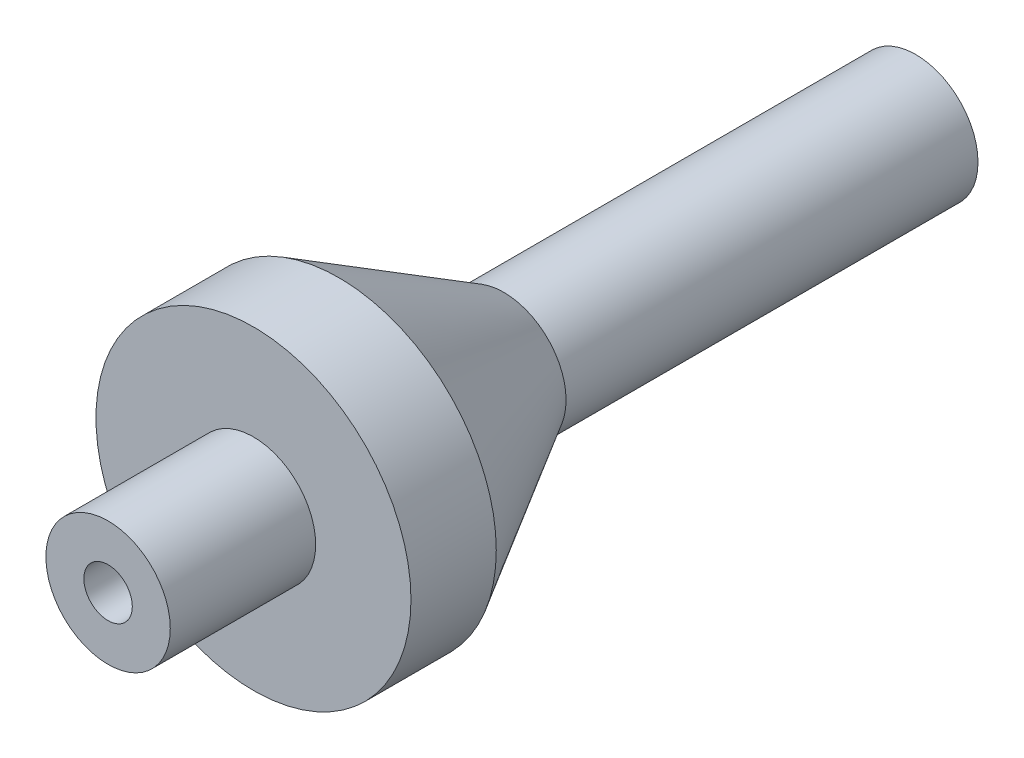
ISO-10303-21;
HEADER;
FILE_DESCRIPTION(('STEP AP214'),'2;1');
FILE_NAME('part.step','',(''),(''),'','','');
FILE_SCHEMA(('AUTOMOTIVE_DESIGN { 1 0 10303 214 1 1 1 1 }'));
ENDSEC;
DATA;
#1=APPLICATION_CONTEXT('core data for automotive mechanical design processes');
#2=APPLICATION_PROTOCOL_DEFINITION('international standard','automotive_design',2000,#1);
#3=PRODUCT_CONTEXT('',#1,'mechanical');
#4=PRODUCT('Part','Part','',(#3));
#5=PRODUCT_RELATED_PRODUCT_CATEGORY('part','',(#4));
#6=PRODUCT_DEFINITION_FORMATION('','',#4);
#7=PRODUCT_DEFINITION_CONTEXT('part definition',#1,'design');
#8=PRODUCT_DEFINITION('design','',#6,#7);
#9=PRODUCT_DEFINITION_SHAPE('','',#8);
#10=(LENGTH_UNIT() NAMED_UNIT(*) SI_UNIT(.MILLI.,.METRE.));
#11=(NAMED_UNIT(*) PLANE_ANGLE_UNIT() SI_UNIT($,.RADIAN.));
#12=(NAMED_UNIT(*) SI_UNIT($,.STERADIAN.) SOLID_ANGLE_UNIT());
#13=UNCERTAINTY_MEASURE_WITH_UNIT(LENGTH_MEASURE(1.E-05),#10,'distance_accuracy_value','');
#14=(GEOMETRIC_REPRESENTATION_CONTEXT(3) GLOBAL_UNCERTAINTY_ASSIGNED_CONTEXT((#13)) GLOBAL_UNIT_ASSIGNED_CONTEXT((#10,
#11,#12)) REPRESENTATION_CONTEXT('',''));
#15=CARTESIAN_POINT('',(0.,0.,0.));
#16=DIRECTION('',(0.,0.,1.));
#17=DIRECTION('',(1.,0.,0.));
#18=AXIS2_PLACEMENT_3D('',#15,#16,#17);
#19=CARTESIAN_POINT('',(0.,0.,0.));
#20=DIRECTION('',(0.,0.,1.));
#21=DIRECTION('',(1.,0.,0.));
#22=AXIS2_PLACEMENT_3D('',#19,#20,#21);
#23=CYLINDRICAL_SURFACE('',#22,1.5);
#24=CARTESIAN_POINT('',(0.,0.,0.));
#25=DIRECTION('',(0.,0.,1.));
#26=DIRECTION('',(1.,0.,0.));
#27=AXIS2_PLACEMENT_3D('',#24,#25,#26);
#28=CIRCLE('',#27,1.5);
#29=CARTESIAN_POINT('',(1.5,0.,0.));
#30=VERTEX_POINT('',#29);
#31=EDGE_CURVE('E76',#30,#30,#28,.T.);
#32=ORIENTED_EDGE('',*,*,#31,.T.);
#33=EDGE_LOOP('',(#32));
#34=FACE_BOUND('',#33,.T.);
#35=CARTESIAN_POINT('',(0.,0.,-50.));
#36=DIRECTION('',(0.,0.,1.));
#37=DIRECTION('',(1.,0.,0.));
#38=AXIS2_PLACEMENT_3D('',#35,#36,#37);
#39=CIRCLE('',#38,1.5);
#40=CARTESIAN_POINT('',(1.5,0.,-50.));
#41=VERTEX_POINT('',#40);
#42=EDGE_CURVE('E53',#41,#41,#39,.T.);
#43=ORIENTED_EDGE('',*,*,#42,.F.);
#44=EDGE_LOOP('',(#43));
#45=FACE_BOUND('',#44,.T.);
#46=ADVANCED_FACE('F39',(#34,#45),#23,.F.);
#47=CARTESIAN_POINT('',(1.5,0.,-50.));
#48=DIRECTION('',(0.,0.,-1.));
#49=DIRECTION('',(-1.,0.,0.));
#50=AXIS2_PLACEMENT_3D('',#47,#48,#49);
#51=PLANE('',#50);
#52=ORIENTED_EDGE('',*,*,#42,.T.);
#53=EDGE_LOOP('',(#52));
#54=FACE_BOUND('',#53,.T.);
#55=CARTESIAN_POINT('',(0.,0.,-50.));
#56=DIRECTION('',(0.,0.,1.));
#57=DIRECTION('',(1.,0.,0.));
#58=AXIS2_PLACEMENT_3D('',#55,#56,#57);
#59=CIRCLE('',#58,3.84999999999999);
#60=CARTESIAN_POINT('',(3.84999999999999,0.,-50.));
#61=VERTEX_POINT('',#60);
#62=EDGE_CURVE('E58',#61,#61,#59,.T.);
#63=ORIENTED_EDGE('',*,*,#62,.F.);
#64=EDGE_LOOP('',(#63));
#65=FACE_BOUND('',#64,.T.);
#66=ADVANCED_FACE('F97',(#54,#65),#51,.T.);
#67=CARTESIAN_POINT('',(0.,0.,0.));
#68=DIRECTION('',(0.,0.,1.));
#69=DIRECTION('',(1.,0.,0.));
#70=AXIS2_PLACEMENT_3D('',#67,#68,#69);
#71=CYLINDRICAL_SURFACE('',#70,3.85);
#72=CARTESIAN_POINT('',(0.,0.,-24.5));
#73=DIRECTION('',(0.,0.,-1.));
#74=DIRECTION('',(-1.,0.,0.));
#75=AXIS2_PLACEMENT_3D('',#72,#73,#74);
#76=CIRCLE('',#75,3.85);
#77=CARTESIAN_POINT('',(-3.85,0.,-24.5));
#78=VERTEX_POINT('',#77);
#79=EDGE_CURVE('E48',#78,#78,#76,.T.);
#80=ORIENTED_EDGE('',*,*,#79,.T.);
#81=EDGE_LOOP('',(#80));
#82=FACE_BOUND('',#81,.T.);
#83=ORIENTED_EDGE('',*,*,#62,.T.);
#84=EDGE_LOOP('',(#83));
#85=FACE_BOUND('',#84,.T.);
#86=ADVANCED_FACE('F101',(#82,#85),#71,.T.);
#87=CARTESIAN_POINT('',(0.,0.,0.));
#88=DIRECTION('',(0.,0.,1.));
#89=DIRECTION('',(1.,0.,0.));
#90=AXIS2_PLACEMENT_3D('',#87,#88,#89);
#91=CYLINDRICAL_SURFACE('',#90,9.75);
#92=CARTESIAN_POINT('',(0.,0.,-14.2809002353438));
#93=DIRECTION('',(0.,0.,1.));
#94=DIRECTION('',(1.,0.,0.));
#95=AXIS2_PLACEMENT_3D('',#92,#93,#94);
#96=CIRCLE('',#95,9.75);
#97=CARTESIAN_POINT('',(9.75,0.,-14.2809002353438));
#98=VERTEX_POINT('',#97);
#99=EDGE_CURVE('E10',#98,#98,#96,.T.);
#100=ORIENTED_EDGE('',*,*,#99,.T.);
#101=EDGE_LOOP('',(#100));
#102=FACE_BOUND('',#101,.T.);
#103=CARTESIAN_POINT('',(0.,0.,-9.));
#104=DIRECTION('',(0.,0.,1.));
#105=DIRECTION('',(1.,0.,0.));
#106=AXIS2_PLACEMENT_3D('',#103,#104,#105);
#107=CIRCLE('',#106,9.75);
#108=CARTESIAN_POINT('',(9.75,0.,-9.));
#109=VERTEX_POINT('',#108);
#110=EDGE_CURVE('E64',#109,#109,#107,.T.);
#111=ORIENTED_EDGE('',*,*,#110,.F.);
#112=EDGE_LOOP('',(#111));
#113=FACE_BOUND('',#112,.T.);
#114=ADVANCED_FACE('F107',(#102,#113),#91,.T.);
#115=CARTESIAN_POINT('',(9.75,0.,-9.));
#116=DIRECTION('',(0.,0.,1.));
#117=DIRECTION('',(1.,0.,0.));
#118=AXIS2_PLACEMENT_3D('',#115,#116,#117);
#119=PLANE('',#118);
#120=ORIENTED_EDGE('',*,*,#110,.T.);
#121=EDGE_LOOP('',(#120));
#122=FACE_BOUND('',#121,.T.);
#123=CARTESIAN_POINT('',(0.,0.,-9.));
#124=DIRECTION('',(0.,0.,1.));
#125=DIRECTION('',(1.,0.,0.));
#126=AXIS2_PLACEMENT_3D('',#123,#124,#125);
#127=CIRCLE('',#126,3.85);
#128=CARTESIAN_POINT('',(3.85,0.,-9.));
#129=VERTEX_POINT('',#128);
#130=EDGE_CURVE('E68',#129,#129,#127,.T.);
#131=ORIENTED_EDGE('',*,*,#130,.F.);
#132=EDGE_LOOP('',(#131));
#133=FACE_BOUND('',#132,.T.);
#134=ADVANCED_FACE('F93',(#122,#133),#119,.T.);
#135=CARTESIAN_POINT('',(0.,0.,0.));
#136=DIRECTION('',(0.,0.,1.));
#137=DIRECTION('',(1.,0.,0.));
#138=AXIS2_PLACEMENT_3D('',#135,#136,#137);
#139=CYLINDRICAL_SURFACE('',#138,3.85);
#140=ORIENTED_EDGE('',*,*,#130,.T.);
#141=EDGE_LOOP('',(#140));
#142=FACE_BOUND('',#141,.T.);
#143=CARTESIAN_POINT('',(0.,0.,0.));
#144=DIRECTION('',(0.,0.,1.));
#145=DIRECTION('',(1.,0.,0.));
#146=AXIS2_PLACEMENT_3D('',#143,#144,#145);
#147=CIRCLE('',#146,3.85);
#148=CARTESIAN_POINT('',(3.85,0.,0.));
#149=VERTEX_POINT('',#148);
#150=EDGE_CURVE('E72',#149,#149,#147,.T.);
#151=ORIENTED_EDGE('',*,*,#150,.F.);
#152=EDGE_LOOP('',(#151));
#153=FACE_BOUND('',#152,.T.);
#154=ADVANCED_FACE('F85',(#142,#153),#139,.T.);
#155=CARTESIAN_POINT('',(1.5,0.,0.));
#156=DIRECTION('',(0.,0.,1.));
#157=DIRECTION('',(1.,0.,0.));
#158=AXIS2_PLACEMENT_3D('',#155,#156,#157);
#159=PLANE('',#158);
#160=ORIENTED_EDGE('',*,*,#150,.T.);
#161=EDGE_LOOP('',(#160));
#162=FACE_BOUND('',#161,.T.);
#163=ORIENTED_EDGE('',*,*,#31,.F.);
#164=EDGE_LOOP('',(#163));
#165=FACE_BOUND('',#164,.T.);
#166=ADVANCED_FACE('F83',(#162,#165),#159,.T.);
#167=CARTESIAN_POINT('',(0.,0.,-14.));
#168=DIRECTION('',(0.,0.,1.));
#169=DIRECTION('',(1.,0.,0.));
#170=AXIS2_PLACEMENT_3D('',#167,#168,#169);
#171=CONICAL_SURFACE('',#170,9.91217782649119,0.523598775598306);
#172=ORIENTED_EDGE('',*,*,#79,.F.);
#173=EDGE_LOOP('',(#172));
#174=FACE_BOUND('',#173,.T.);
#175=ORIENTED_EDGE('',*,*,#99,.F.);
#176=EDGE_LOOP('',(#175));
#177=FACE_BOUND('',#176,.T.);
#178=ADVANCED_FACE('F42',(#174,#177),#171,.T.);
#179=CLOSED_SHELL('',(#46,#66,#86,#114,#134,#154,#166,#178));
#180=MANIFOLD_SOLID_BREP('B2',#179);
#181=ADVANCED_BREP_SHAPE_REPRESENTATION('',(#18,#180),#14);
#182=SHAPE_DEFINITION_REPRESENTATION(#9,#181);
ENDSEC;
END-ISO-10303-21;
